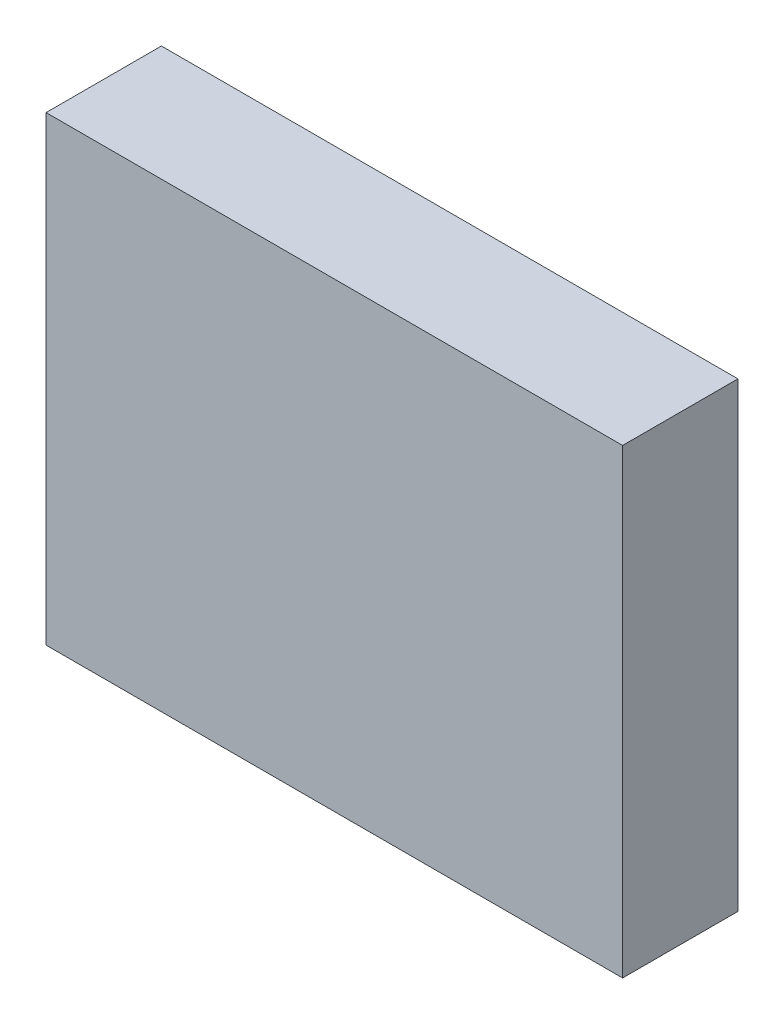
ISO-10303-21;
HEADER;
FILE_DESCRIPTION(('STEP AP214'),'2;1');
FILE_NAME('part.step','',(''),(''),'','','');
FILE_SCHEMA(('AUTOMOTIVE_DESIGN { 1 0 10303 214 1 1 1 1 }'));
ENDSEC;
DATA;
#1=APPLICATION_CONTEXT('core data for automotive mechanical design processes');
#2=APPLICATION_PROTOCOL_DEFINITION('international standard','automotive_design',2000,#1);
#3=PRODUCT_CONTEXT('',#1,'mechanical');
#4=PRODUCT('Part','Part','',(#3));
#5=PRODUCT_RELATED_PRODUCT_CATEGORY('part','',(#4));
#6=PRODUCT_DEFINITION_FORMATION('','',#4);
#7=PRODUCT_DEFINITION_CONTEXT('part definition',#1,'design');
#8=PRODUCT_DEFINITION('design','',#6,#7);
#9=PRODUCT_DEFINITION_SHAPE('','',#8);
#10=(LENGTH_UNIT() NAMED_UNIT(*) SI_UNIT(.MILLI.,.METRE.));
#11=(NAMED_UNIT(*) PLANE_ANGLE_UNIT() SI_UNIT($,.RADIAN.));
#12=(NAMED_UNIT(*) SI_UNIT($,.STERADIAN.) SOLID_ANGLE_UNIT());
#13=UNCERTAINTY_MEASURE_WITH_UNIT(LENGTH_MEASURE(1.E-05),#10,'distance_accuracy_value','');
#14=(GEOMETRIC_REPRESENTATION_CONTEXT(3) GLOBAL_UNCERTAINTY_ASSIGNED_CONTEXT((#13)) GLOBAL_UNIT_ASSIGNED_CONTEXT((#10,
#11,#12)) REPRESENTATION_CONTEXT('',''));
#15=CARTESIAN_POINT('',(0.,0.,0.));
#16=DIRECTION('',(0.,0.,1.));
#17=DIRECTION('',(1.,0.,0.));
#18=AXIS2_PLACEMENT_3D('',#15,#16,#17);
#19=CARTESIAN_POINT('',(12.5,10.,5.));
#20=DIRECTION('',(-1.,0.,0.));
#21=DIRECTION('',(0.,-1.,0.));
#22=AXIS2_PLACEMENT_3D('',#19,#20,#21);
#23=PLANE('',#22);
#24=DIRECTION('',(0.,1.,0.));
#25=VECTOR('',#24,1.);
#26=CARTESIAN_POINT('',(12.5,10.,0.));
#27=LINE('',#26,#25);
#28=CARTESIAN_POINT('',(12.5,-10.,0.));
#29=VERTEX_POINT('',#28);
#30=CARTESIAN_POINT('',(12.5,10.,0.));
#31=VERTEX_POINT('',#30);
#32=EDGE_CURVE('E98',#29,#31,#27,.T.);
#33=ORIENTED_EDGE('',*,*,#32,.T.);
#34=DIRECTION('',(0.,0.,-1.));
#35=VECTOR('',#34,1.);
#36=CARTESIAN_POINT('',(12.5,10.,5.));
#37=LINE('',#36,#35);
#38=CARTESIAN_POINT('',(12.5,10.,5.));
#39=VERTEX_POINT('',#38);
#40=EDGE_CURVE('E11',#39,#31,#37,.T.);
#41=ORIENTED_EDGE('',*,*,#40,.F.);
#42=DIRECTION('',(0.,1.,0.));
#43=VECTOR('',#42,1.);
#44=CARTESIAN_POINT('',(12.5,10.,5.));
#45=LINE('',#44,#43);
#46=CARTESIAN_POINT('',(12.5,-10.,5.));
#47=VERTEX_POINT('',#46);
#48=EDGE_CURVE('E86',#47,#39,#45,.T.);
#49=ORIENTED_EDGE('',*,*,#48,.F.);
#50=DIRECTION('',(0.,0.,-1.));
#51=VECTOR('',#50,1.);
#52=CARTESIAN_POINT('',(12.5,-10.,5.));
#53=LINE('',#52,#51);
#54=EDGE_CURVE('E94',#47,#29,#53,.T.);
#55=ORIENTED_EDGE('',*,*,#54,.T.);
#56=EDGE_LOOP('',(#33,#41,#49,#55));
#57=FACE_BOUND('',#56,.T.);
#58=ADVANCED_FACE('F35',(#57),#23,.F.);
#59=CARTESIAN_POINT('',(-12.5,10.,5.));
#60=DIRECTION('',(0.,-1.,0.));
#61=DIRECTION('',(0.,0.,-1.));
#62=AXIS2_PLACEMENT_3D('',#59,#60,#61);
#63=PLANE('',#62);
#64=DIRECTION('',(-1.,0.,0.));
#65=VECTOR('',#64,1.);
#66=CARTESIAN_POINT('',(-12.5,10.,0.));
#67=LINE('',#66,#65);
#68=CARTESIAN_POINT('',(-12.5,10.,0.));
#69=VERTEX_POINT('',#68);
#70=EDGE_CURVE('E90',#31,#69,#67,.T.);
#71=ORIENTED_EDGE('',*,*,#70,.T.);
#72=DIRECTION('',(0.,0.,-1.));
#73=VECTOR('',#72,1.);
#74=CARTESIAN_POINT('',(-12.5,10.,5.));
#75=LINE('',#74,#73);
#76=CARTESIAN_POINT('',(-12.5,10.,5.));
#77=VERTEX_POINT('',#76);
#78=EDGE_CURVE('E43',#77,#69,#75,.T.);
#79=ORIENTED_EDGE('',*,*,#78,.F.);
#80=DIRECTION('',(-1.,0.,0.));
#81=VECTOR('',#80,1.);
#82=CARTESIAN_POINT('',(-12.5,10.,5.));
#83=LINE('',#82,#81);
#84=EDGE_CURVE('E81',#39,#77,#83,.T.);
#85=ORIENTED_EDGE('',*,*,#84,.F.);
#86=ORIENTED_EDGE('',*,*,#40,.T.);
#87=EDGE_LOOP('',(#71,#79,#85,#86));
#88=FACE_BOUND('',#87,.T.);
#89=ADVANCED_FACE('F89',(#88),#63,.F.);
#90=CARTESIAN_POINT('',(-12.5,10.,5.));
#91=DIRECTION('',(1.,0.,0.));
#92=DIRECTION('',(0.,1.,0.));
#93=AXIS2_PLACEMENT_3D('',#90,#91,#92);
#94=PLANE('',#93);
#95=DIRECTION('',(0.,-1.,0.));
#96=VECTOR('',#95,1.);
#97=CARTESIAN_POINT('',(-12.5,10.,0.));
#98=LINE('',#97,#96);
#99=CARTESIAN_POINT('',(-12.5,-10.,0.));
#100=VERTEX_POINT('',#99);
#101=EDGE_CURVE('E68',#69,#100,#98,.T.);
#102=ORIENTED_EDGE('',*,*,#101,.T.);
#103=DIRECTION('',(0.,0.,-1.));
#104=VECTOR('',#103,1.);
#105=CARTESIAN_POINT('',(-12.5,-10.,5.));
#106=LINE('',#105,#104);
#107=CARTESIAN_POINT('',(-12.5,-10.,5.));
#108=VERTEX_POINT('',#107);
#109=EDGE_CURVE('E91',#108,#100,#106,.T.);
#110=ORIENTED_EDGE('',*,*,#109,.F.);
#111=DIRECTION('',(0.,-1.,0.));
#112=VECTOR('',#111,1.);
#113=CARTESIAN_POINT('',(-12.5,10.,5.));
#114=LINE('',#113,#112);
#115=EDGE_CURVE('E84',#77,#108,#114,.T.);
#116=ORIENTED_EDGE('',*,*,#115,.F.);
#117=ORIENTED_EDGE('',*,*,#78,.T.);
#118=EDGE_LOOP('',(#102,#110,#116,#117));
#119=FACE_BOUND('',#118,.T.);
#120=ADVANCED_FACE('F92',(#119),#94,.F.);
#121=CARTESIAN_POINT('',(-12.5,-10.,5.));
#122=DIRECTION('',(0.,1.,0.));
#123=DIRECTION('',(0.,0.,1.));
#124=AXIS2_PLACEMENT_3D('',#121,#122,#123);
#125=PLANE('',#124);
#126=DIRECTION('',(1.,0.,0.));
#127=VECTOR('',#126,1.);
#128=CARTESIAN_POINT('',(-12.5,-10.,0.));
#129=LINE('',#128,#127);
#130=EDGE_CURVE('E74',#100,#29,#129,.T.);
#131=ORIENTED_EDGE('',*,*,#130,.T.);
#132=ORIENTED_EDGE('',*,*,#54,.F.);
#133=DIRECTION('',(1.,0.,0.));
#134=VECTOR('',#133,1.);
#135=CARTESIAN_POINT('',(-12.5,-10.,5.));
#136=LINE('',#135,#134);
#137=EDGE_CURVE('E51',#108,#47,#136,.T.);
#138=ORIENTED_EDGE('',*,*,#137,.F.);
#139=ORIENTED_EDGE('',*,*,#109,.T.);
#140=EDGE_LOOP('',(#131,#132,#138,#139));
#141=FACE_BOUND('',#140,.T.);
#142=ADVANCED_FACE('F105',(#141),#125,.F.);
#143=CARTESIAN_POINT('',(0.,0.,5.));
#144=DIRECTION('',(0.,0.,1.));
#145=DIRECTION('',(1.,0.,0.));
#146=AXIS2_PLACEMENT_3D('',#143,#144,#145);
#147=PLANE('',#146);
#148=ORIENTED_EDGE('',*,*,#48,.T.);
#149=ORIENTED_EDGE('',*,*,#84,.T.);
#150=ORIENTED_EDGE('',*,*,#115,.T.);
#151=ORIENTED_EDGE('',*,*,#137,.T.);
#152=EDGE_LOOP('',(#148,#149,#150,#151));
#153=FACE_BOUND('',#152,.T.);
#154=ADVANCED_FACE('F82',(#153),#147,.T.);
#155=CARTESIAN_POINT('',(0.,0.,0.));
#156=DIRECTION('',(0.,0.,1.));
#157=DIRECTION('',(1.,0.,0.));
#158=AXIS2_PLACEMENT_3D('',#155,#156,#157);
#159=PLANE('',#158);
#160=ORIENTED_EDGE('',*,*,#32,.F.);
#161=ORIENTED_EDGE('',*,*,#130,.F.);
#162=ORIENTED_EDGE('',*,*,#101,.F.);
#163=ORIENTED_EDGE('',*,*,#70,.F.);
#164=EDGE_LOOP('',(#160,#161,#162,#163));
#165=FACE_BOUND('',#164,.T.);
#166=ADVANCED_FACE('F108',(#165),#159,.F.);
#167=CLOSED_SHELL('',(#58,#89,#120,#142,#154,#166));
#168=MANIFOLD_SOLID_BREP('B2',#167);
#169=ADVANCED_BREP_SHAPE_REPRESENTATION('',(#18,#168),#14);
#170=SHAPE_DEFINITION_REPRESENTATION(#9,#169);
ENDSEC;
END-ISO-10303-21;
